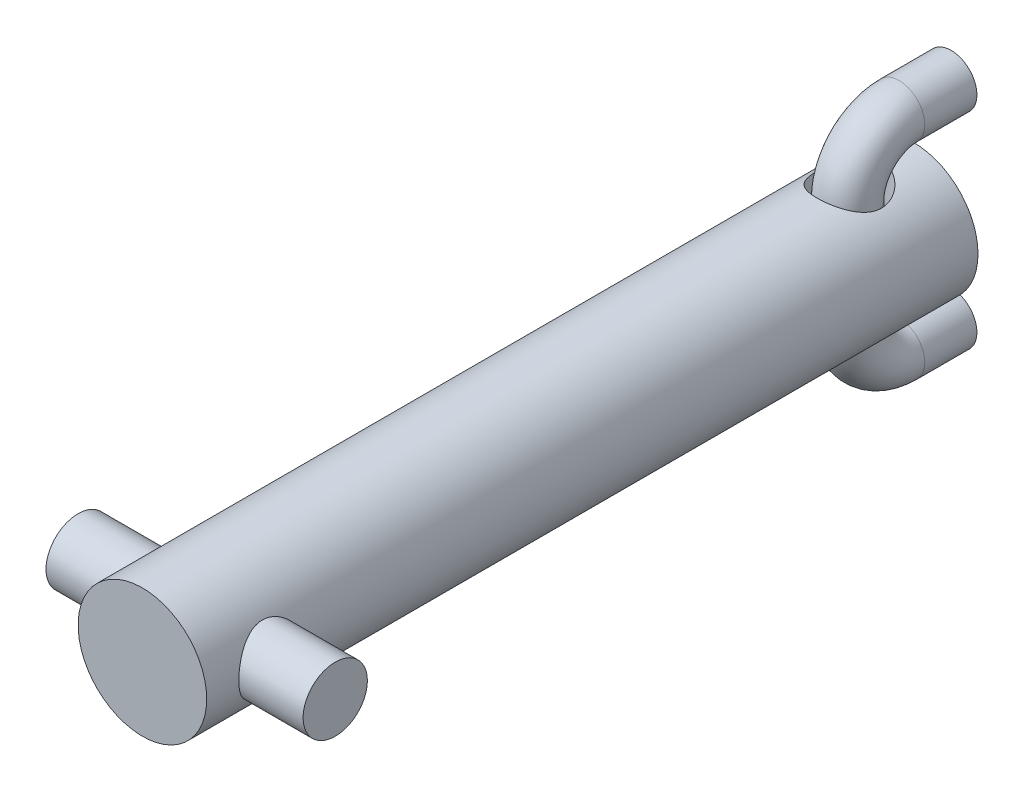
ISO-10303-21;
HEADER;
FILE_DESCRIPTION(('STEP AP214'),'2;1');
FILE_NAME('part.step','',(''),(''),'','','');
FILE_SCHEMA(('AUTOMOTIVE_DESIGN { 1 0 10303 214 1 1 1 1 }'));
ENDSEC;
DATA;
#1=APPLICATION_CONTEXT('core data for automotive mechanical design processes');
#2=APPLICATION_PROTOCOL_DEFINITION('international standard','automotive_design',2000,#1);
#3=PRODUCT_CONTEXT('',#1,'mechanical');
#4=PRODUCT('Part','Part','',(#3));
#5=PRODUCT_RELATED_PRODUCT_CATEGORY('part','',(#4));
#6=PRODUCT_DEFINITION_FORMATION('','',#4);
#7=PRODUCT_DEFINITION_CONTEXT('part definition',#1,'design');
#8=PRODUCT_DEFINITION('design','',#6,#7);
#9=PRODUCT_DEFINITION_SHAPE('','',#8);
#10=(LENGTH_UNIT() NAMED_UNIT(*) SI_UNIT(.MILLI.,.METRE.));
#11=(NAMED_UNIT(*) PLANE_ANGLE_UNIT() SI_UNIT($,.RADIAN.));
#12=(NAMED_UNIT(*) SI_UNIT($,.STERADIAN.) SOLID_ANGLE_UNIT());
#13=UNCERTAINTY_MEASURE_WITH_UNIT(LENGTH_MEASURE(1.E-05),#10,'distance_accuracy_value','');
#14=(GEOMETRIC_REPRESENTATION_CONTEXT(3) GLOBAL_UNCERTAINTY_ASSIGNED_CONTEXT((#13)) GLOBAL_UNIT_ASSIGNED_CONTEXT((#10,
#11,#12)) REPRESENTATION_CONTEXT('',''));
#15=CARTESIAN_POINT('',(0.,0.,0.));
#16=DIRECTION('',(0.,0.,1.));
#17=DIRECTION('',(1.,0.,0.));
#18=AXIS2_PLACEMENT_3D('',#15,#16,#17);
#19=CARTESIAN_POINT('',(0.,4.92250109258514,-1.85035109025268));
#20=DIRECTION('',(0.,0.,-1.));
#21=DIRECTION('',(1.,0.,0.));
#22=AXIS2_PLACEMENT_3D('',#19,#20,#21);
#23=PLANE('',#22);
#24=CARTESIAN_POINT('',(0.,4.92250109258514,-1.85035109025268));
#25=DIRECTION('',(0.,0.,-1.));
#26=DIRECTION('',(1.,0.,0.));
#27=AXIS2_PLACEMENT_3D('',#24,#25,#26);
#28=CIRCLE('',#27,1.27);
#29=CARTESIAN_POINT('',(1.27,4.92250109258514,-1.85035109025268));
#30=VERTEX_POINT('',#29);
#31=EDGE_CURVE('E66',#30,#30,#28,.T.);
#32=ORIENTED_EDGE('',*,*,#31,.T.);
#33=EDGE_LOOP('',(#32));
#34=FACE_BOUND('',#33,.T.);
#35=ADVANCED_FACE('F54',(#34),#23,.T.);
#36=CARTESIAN_POINT('',(0.,-5.23749890741486,-1.85035109025268));
#37=DIRECTION('',(0.,0.,1.));
#38=DIRECTION('',(1.,0.,0.));
#39=AXIS2_PLACEMENT_3D('',#36,#37,#38);
#40=PLANE('',#39);
#41=CARTESIAN_POINT('',(0.,-5.23749890741486,-1.85035109025268));
#42=DIRECTION('',(0.,0.,1.));
#43=DIRECTION('',(1.,0.,0.));
#44=AXIS2_PLACEMENT_3D('',#41,#42,#43);
#45=CIRCLE('',#44,1.27);
#46=CARTESIAN_POINT('',(1.27,-5.23749890741486,-1.85035109025268));
#47=VERTEX_POINT('',#46);
#48=EDGE_CURVE('E13',#47,#47,#45,.T.);
#49=ORIENTED_EDGE('',*,*,#48,.F.);
#50=EDGE_LOOP('',(#49));
#51=FACE_BOUND('',#50,.T.);
#52=ADVANCED_FACE('F72',(#51),#40,.F.);
#53=CARTESIAN_POINT('',(0.,4.92250109258514,-1.85035109025268));
#54=DIRECTION('',(0.,0.,1.));
#55=DIRECTION('',(1.,0.,0.));
#56=AXIS2_PLACEMENT_3D('',#53,#54,#55);
#57=CYLINDRICAL_SURFACE('',#56,1.27);
#58=CARTESIAN_POINT('',(0.,4.92250109258514,0.723036468645226));
#59=DIRECTION('',(0.,0.,-1.));
#60=DIRECTION('',(1.,0.,0.));
#61=AXIS2_PLACEMENT_3D('',#58,#59,#60);
#62=CIRCLE('',#61,1.27);
#63=CARTESIAN_POINT('',(0.,6.19250109258514,0.723036468645217));
#64=VERTEX_POINT('',#63);
#65=EDGE_CURVE('E106',#64,#64,#62,.T.);
#66=ORIENTED_EDGE('',*,*,#65,.T.);
#67=EDGE_LOOP('',(#66));
#68=FACE_BOUND('',#67,.T.);
#69=ORIENTED_EDGE('',*,*,#31,.F.);
#70=EDGE_LOOP('',(#69));
#71=FACE_BOUND('',#70,.T.);
#72=ADVANCED_FACE('F74',(#68,#71),#57,.T.);
#73=CARTESIAN_POINT('',(0.,2.38250109258514,0.723036468645244));
#74=DIRECTION('',(1.,0.,0.));
#75=DIRECTION('',(0.,0.,-1.));
#76=AXIS2_PLACEMENT_3D('',#73,#74,#75);
#77=TOROIDAL_SURFACE('',#76,2.54,1.27);
#78=CARTESIAN_POINT('',(0.,2.38250109258512,3.26303646864524));
#79=DIRECTION('',(0.,1.,0.));
#80=DIRECTION('',(1.,0.,0.));
#81=AXIS2_PLACEMENT_3D('',#78,#79,#80);
#82=CIRCLE('',#81,1.27);
#83=CARTESIAN_POINT('',(0.,2.38250109258512,4.53303646864524));
#84=VERTEX_POINT('',#83);
#85=EDGE_CURVE('E103',#84,#84,#82,.T.);
#86=CARTESIAN_POINT('',(0.,2.38250109258514,0.723036468645244));
#87=DIRECTION('',(1.,0.,0.));
#88=DIRECTION('',(0.,0.,-1.));
#89=AXIS2_PLACEMENT_3D('',#86,#87,#88);
#90=CIRCLE('',#89,3.81);
#91=EDGE_CURVE('',#64,#84,#90,.T.);
#92=ORIENTED_EDGE('',*,*,#65,.F.);
#93=ORIENTED_EDGE('',*,*,#85,.T.);
#94=ORIENTED_EDGE('',*,*,#91,.T.);
#95=ORIENTED_EDGE('',*,*,#91,.F.);
#96=EDGE_LOOP('',(#92,#94,#93,#95));
#97=FACE_BOUND('',#96,.T.);
#98=ADVANCED_FACE('F79',(#97),#77,.T.);
#99=CARTESIAN_POINT('',(0.,2.38250109258512,3.26303646864524));
#100=DIRECTION('',(0.,-1.,0.));
#101=DIRECTION('',(0.,0.,-1.));
#102=AXIS2_PLACEMENT_3D('',#99,#100,#101);
#103=CYLINDRICAL_SURFACE('',#102,1.27);
#104=CARTESIAN_POINT('',(0.,-2.69749890741484,3.26303646864524));
#105=DIRECTION('',(0.,1.,0.));
#106=DIRECTION('',(1.,0.,0.));
#107=AXIS2_PLACEMENT_3D('',#104,#105,#106);
#108=CIRCLE('',#107,1.27);
#109=CARTESIAN_POINT('',(0.,-2.69749890741483,4.53303646864524));
#110=VERTEX_POINT('',#109);
#111=EDGE_CURVE('E108',#110,#110,#108,.T.);
#112=ORIENTED_EDGE('',*,*,#111,.T.);
#113=EDGE_LOOP('',(#112));
#114=FACE_BOUND('',#113,.T.);
#115=ORIENTED_EDGE('',*,*,#85,.F.);
#116=EDGE_LOOP('',(#115));
#117=FACE_BOUND('',#116,.T.);
#118=ADVANCED_FACE('F89',(#114,#117),#103,.T.);
#119=CARTESIAN_POINT('',(0.,-2.69749890741486,0.723036468645245));
#120=DIRECTION('',(1.,0.,0.));
#121=DIRECTION('',(0.,0.,-1.));
#122=AXIS2_PLACEMENT_3D('',#119,#120,#121);
#123=TOROIDAL_SURFACE('',#122,2.54,1.27);
#124=CARTESIAN_POINT('',(0.,-5.23749890741487,0.723036468645263));
#125=DIRECTION('',(0.,0.,1.));
#126=DIRECTION('',(1.,0.,0.));
#127=AXIS2_PLACEMENT_3D('',#124,#125,#126);
#128=CIRCLE('',#127,1.27);
#129=CARTESIAN_POINT('',(0.,-6.50749890741486,0.723036468645273));
#130=VERTEX_POINT('',#129);
#131=EDGE_CURVE('E61',#130,#130,#128,.T.);
#132=CARTESIAN_POINT('',(0.,-2.69749890741486,0.723036468645245));
#133=DIRECTION('',(1.,0.,0.));
#134=DIRECTION('',(0.,0.,-1.));
#135=AXIS2_PLACEMENT_3D('',#132,#133,#134);
#136=CIRCLE('',#135,3.81);
#137=EDGE_CURVE('',#110,#130,#136,.T.);
#138=ORIENTED_EDGE('',*,*,#111,.F.);
#139=ORIENTED_EDGE('',*,*,#131,.T.);
#140=ORIENTED_EDGE('',*,*,#137,.T.);
#141=ORIENTED_EDGE('',*,*,#137,.F.);
#142=EDGE_LOOP('',(#138,#140,#139,#141));
#143=FACE_BOUND('',#142,.T.);
#144=ADVANCED_FACE('F85',(#143),#123,.T.);
#145=CARTESIAN_POINT('',(0.,-5.23749890741486,0.723036468645228));
#146=DIRECTION('',(0.,0.,-1.));
#147=DIRECTION('',(-1.,0.,0.));
#148=AXIS2_PLACEMENT_3D('',#145,#146,#147);
#149=CYLINDRICAL_SURFACE('',#148,1.27);
#150=ORIENTED_EDGE('',*,*,#48,.T.);
#151=EDGE_LOOP('',(#150));
#152=FACE_BOUND('',#151,.T.);
#153=ORIENTED_EDGE('',*,*,#131,.F.);
#154=EDGE_LOOP('',(#153));
#155=FACE_BOUND('',#154,.T.);
#156=ADVANCED_FACE('F69',(#152,#155),#149,.T.);
#157=CLOSED_SHELL('',(#35,#52,#72,#98,#118,#144,#156));
#158=MANIFOLD_SOLID_BREP('B2',#157);
#159=CARTESIAN_POINT('',(0.,0.,38.1));
#160=DIRECTION('',(0.,0.,-1.));
#161=DIRECTION('',(-1.,0.,0.));
#162=AXIS2_PLACEMENT_3D('',#159,#160,#161);
#163=CYLINDRICAL_SURFACE('',#162,3.175);
#164=CARTESIAN_POINT('',(0.,-3.175,4.7625));
#165=CARTESIAN_POINT('',(0.083457991185083,-3.17499545030502,4.76249475757146));
#166=CARTESIAN_POINT('',(0.16701547701988,-3.17167404493863,4.75588000892032));
#167=CARTESIAN_POINT('',(0.331660873489372,-3.15871472708987,4.72971355245781));
#168=CARTESIAN_POINT('',(0.412743787657886,-3.1490648192841,4.71013727611597));
#169=CARTESIAN_POINT('',(0.569807002497712,-3.12445843552858,4.6590048288211));
#170=CARTESIAN_POINT('',(0.645805799665894,-3.10952259694341,4.62749521500635));
#171=CARTESIAN_POINT('',(0.791325279180474,-3.07571420218771,4.55363163858309));
#172=CARTESIAN_POINT('',(0.860846471709218,-3.05684195643221,4.51127853100493));
#173=CARTESIAN_POINT('',(0.99616866069703,-3.01555559984673,4.41401636644211));
#174=CARTESIAN_POINT('',(1.06149014765635,-2.99299628614965,4.35850271420707));
#175=CARTESIAN_POINT('',(1.18233736872633,-2.94735202766705,4.23779715169533));
#176=CARTESIAN_POINT('',(1.23785563818199,-2.92426669731842,4.17259793531125));
#177=CARTESIAN_POINT('',(1.34183755071481,-2.87812085025789,4.02830768263163));
#178=CARTESIAN_POINT('',(1.38942022018822,-2.85520109315084,3.94853144387586));
#179=CARTESIAN_POINT('',(1.47029206018898,-2.81441491301059,3.78084185412188));
#180=CARTESIAN_POINT('',(1.50359144125905,-2.79654488326096,3.69293437065264));
#181=CARTESIAN_POINT('',(1.55278525197438,-2.76951863922521,3.5168441451427));
#182=CARTESIAN_POINT('',(1.5696022981152,-2.75990481139145,3.42899293234301));
#183=CARTESIAN_POINT('',(1.58817785187779,-2.74926250293288,3.25123359502508));
#184=CARTESIAN_POINT('',(1.58995124029226,-2.7482255383247,3.16132759136704));
#185=CARTESIAN_POINT('',(1.57906606838602,-2.75448601783382,2.99357093639935));
#186=CARTESIAN_POINT('',(1.5681079882647,-2.76080162313447,2.91556435043341));
#187=CARTESIAN_POINT('',(1.53501701037788,-2.77933513114987,2.76269146887029));
#188=CARTESIAN_POINT('',(1.51288055293752,-2.79155491395445,2.68782618182781));
#189=CARTESIAN_POINT('',(1.45765802636278,-2.82078868805226,2.54122375205201));
#190=CARTESIAN_POINT('',(1.42432891904664,-2.83790772054098,2.46960009192756));
#191=CARTESIAN_POINT('',(1.34785367917295,-2.87501654296728,2.33261806051336));
#192=CARTESIAN_POINT('',(1.30470313705229,-2.89500762088553,2.26726252223486));
#193=CARTESIAN_POINT('',(1.20342986217405,-2.93867138171466,2.13594751127013));
#194=CARTESIAN_POINT('',(1.14410245266123,-2.96248947500834,2.07096221319785));
#195=CARTESIAN_POINT('',(1.01529448125193,-3.00906851989396,1.95145752298694));
#196=CARTESIAN_POINT('',(0.945809094811679,-3.03182896234596,1.89694313264621));
#197=CARTESIAN_POINT('',(0.79456995300806,-3.07501904811705,1.79754901311531));
#198=CARTESIAN_POINT('',(0.712396326664062,-3.09529137357186,1.75323424999239));
#199=CARTESIAN_POINT('',(0.540490117088466,-3.12988136279972,1.67942096639422));
#200=CARTESIAN_POINT('',(0.450763602321127,-3.14420375322891,1.64991068128842));
#201=CARTESIAN_POINT('',(0.274266805511366,-3.16427379814529,1.60897029659978));
#202=CARTESIAN_POINT('',(0.187867179745469,-3.17063339553329,1.59624516325198));
#203=CARTESIAN_POINT('',(0.013937614919597,-3.17615908866327,1.585174739324));
#204=CARTESIAN_POINT('',(-0.0735917690434789,-3.17532859220093,1.58682263654734));
#205=CARTESIAN_POINT('',(-0.240082343027753,-3.16692267702328,1.60370311786476));
#206=CARTESIAN_POINT('',(-0.319181810279264,-3.15987502529967,1.61787289570887));
#207=CARTESIAN_POINT('',(-0.473720941529331,-3.14042696962309,1.65772793913351));
#208=CARTESIAN_POINT('',(-0.5491602010346,-3.12802597555879,1.68341447424492));
#209=CARTESIAN_POINT('',(-0.696735665913696,-3.09854999119071,1.74624756546244));
#210=CARTESIAN_POINT('',(-0.768715755246713,-3.08135149809289,1.78370079205961));
#211=CARTESIAN_POINT('',(-0.905607411697593,-3.043935592289,1.86865821283893));
#212=CARTESIAN_POINT('',(-0.970515949770339,-3.02371689462514,1.91616668867019));
#213=CARTESIAN_POINT('',(-1.09818120674663,-2.97986801371214,2.02526967521251));
#214=CARTESIAN_POINT('',(-1.16010067353771,-2.95609779689055,2.08778930365667));
#215=CARTESIAN_POINT('',(-1.27294690977618,-2.90929046679002,2.22238117765339));
#216=CARTESIAN_POINT('',(-1.3238660748176,-2.88625386997575,2.29445997617107));
#217=CARTESIAN_POINT('',(-1.41558631423544,-2.84243767627802,2.4505343009996));
#218=CARTESIAN_POINT('',(-1.45577797458289,-2.82182140722634,2.53493788492499));
#219=CARTESIAN_POINT('',(-1.52095648617134,-2.78723839766939,2.71067223227526));
#220=CARTESIAN_POINT('',(-1.54596292893889,-2.77326309427028,2.80199389826619));
#221=CARTESIAN_POINT('',(-1.57775542885366,-2.75528882878461,2.97959497882947));
#222=CARTESIAN_POINT('',(-1.58606013179365,-2.75046096250791,3.06551687732845));
#223=CARTESIAN_POINT('',(-1.58859403257222,-2.74900000493545,3.23762221912368));
#224=CARTESIAN_POINT('',(-1.5828293315144,-2.75236336156894,3.32380553287135));
#225=CARTESIAN_POINT('',(-1.55880772437938,-2.76602606006084,3.48533005868433));
#226=CARTESIAN_POINT('',(-1.54179319901957,-2.7756341249122,3.56092199635477));
#227=CARTESIAN_POINT('',(-1.49729088118125,-2.79988988197899,3.70809538958618));
#228=CARTESIAN_POINT('',(-1.46979971971638,-2.81453919516849,3.7796755465711));
#229=CARTESIAN_POINT('',(-1.40305749566465,-2.848427919537,3.92211695094113));
#230=CARTESIAN_POINT('',(-1.36314043128243,-2.86790959303524,3.99260679415358));
#231=CARTESIAN_POINT('',(-1.27341466747436,-2.90886088970341,4.12634832618775));
#232=CARTESIAN_POINT('',(-1.22360082184598,-2.93033154400532,4.18959622220226));
#233=CARTESIAN_POINT('',(-1.10839778107493,-2.97596438013471,4.31505039698805));
#234=CARTESIAN_POINT('',(-1.04185152150815,-3.00013660999272,4.37619632498109));
#235=CARTESIAN_POINT('',(-0.898770754895201,-3.0460593171264,4.48669248620349));
#236=CARTESIAN_POINT('',(-0.822230898247,-3.06780848569085,4.53603636140848));
#237=CARTESIAN_POINT('',(-0.660291409892926,-3.10670590186878,4.62158772580541));
#238=CARTESIAN_POINT('',(-0.574832962245559,-3.12382053184118,4.65769986866289));
#239=CARTESIAN_POINT('',(-0.398053085556712,-3.15120879312142,4.71457046631489));
#240=CARTESIAN_POINT('',(-0.306749131847695,-3.1615018583887,4.73537255680407));
#241=CARTESIAN_POINT('',(-0.178755590054295,-3.17016545787646,4.75281214009861));
#242=CARTESIAN_POINT('',(-0.143131983613483,-3.17197367477648,4.75643994237531));
#243=CARTESIAN_POINT('',(-0.0716783742405821,-3.17439193950695,4.76128503150361));
#244=CARTESIAN_POINT('',(-0.0358483656390222,-3.17500195426617,4.76250225182145));
#245=CARTESIAN_POINT('',(0.,-3.175,4.7625));
#246=B_SPLINE_CURVE_WITH_KNOTS('',3,(#164,#165,#166,#167,#168,#169,#170,#171,#172,#173,#174,
#175,#176,#177,#178,#179,#180,#181,#182,#183,#184,#185,#186,#187,#188,#189,#190,#191,#192,#193,
#194,#195,#196,#197,#198,#199,#200,#201,#202,#203,#204,#205,#206,#207,#208,#209,#210,#211,#212,
#213,#214,#215,#216,#217,#218,#219,#220,#221,#222,#223,#224,#225,#226,#227,#228,#229,#230,#231,
#232,#233,#234,#235,#236,#237,#238,#239,#240,#241,#242,#243,#244,#245),.UNSPECIFIED.,.T.,.F.,(4,
2,2,2,2,2,2,2,2,2,2,2,2,2,2,2,2,2,2,2,2,2,2,2,2,2,2,2,2,2,2,2,2,2,2,2,2,2,2,2,4),(0.,
0.250228508654714,0.50093268766335,0.750668671844022,1.00038496992324,1.26520854196496,
1.53023290227578,1.8158099070882,2.10118242288521,2.36947094272614,2.6374940475982,
2.87346568449797,3.10951251232015,3.35105756267474,3.59271127500602,3.86500594367532,
4.13743036175414,4.42250547765424,4.70735369348244,4.96860973623261,5.22974196161968,
5.47063464078469,5.71155388089104,5.95936158944289,6.20727503062989,6.47953381898015,
6.75198021926998,7.0376205793174,7.32289162713403,7.58077775661086,7.83855207535177,
8.07176964270058,8.30506226951507,8.55402875138706,8.80312503315514,9.0824882287701,
9.36200158617728,9.64349121690848,9.92417542436075,10.0316550721259,10.1391376863632),.UNSPECIFIED.);
#247=CARTESIAN_POINT('',(0.,-3.175,4.7625));
#248=VERTEX_POINT('',#247);
#249=EDGE_CURVE('E181',#248,#248,#246,.T.);
#250=ORIENTED_EDGE('',*,*,#249,.T.);
#251=EDGE_LOOP('',(#250));
#252=FACE_BOUND('',#251,.T.);
#253=CARTESIAN_POINT('',(0.,3.175,4.7625));
#254=CARTESIAN_POINT('',(-0.0834579911850828,3.17499545030503,4.76249475757146));
#255=CARTESIAN_POINT('',(-0.16701547701988,3.17167404493863,4.75588000892032));
#256=CARTESIAN_POINT('',(-0.331660873489372,3.15871472708987,4.72971355245781));
#257=CARTESIAN_POINT('',(-0.412743787657886,3.1490648192841,4.71013727611597));
#258=CARTESIAN_POINT('',(-0.569807002497712,3.12445843552858,4.6590048288211));
#259=CARTESIAN_POINT('',(-0.645805799665894,3.10952259694341,4.62749521500635));
#260=CARTESIAN_POINT('',(-0.791325279180474,3.07571420218771,4.55363163858309));
#261=CARTESIAN_POINT('',(-0.860846471709217,3.05684195643221,4.51127853100493));
#262=CARTESIAN_POINT('',(-0.99616866069703,3.01555559984673,4.41401636644211));
#263=CARTESIAN_POINT('',(-1.06149014765635,2.99299628614965,4.35850271420707));
#264=CARTESIAN_POINT('',(-1.18233736872633,2.94735202766705,4.23779715169533));
#265=CARTESIAN_POINT('',(-1.23785563818199,2.92426669731843,4.17259793531125));
#266=CARTESIAN_POINT('',(-1.34183755071481,2.87812085025789,4.02830768263163));
#267=CARTESIAN_POINT('',(-1.38942022018822,2.85520109315084,3.94853144387586));
#268=CARTESIAN_POINT('',(-1.47029206018898,2.81441491301059,3.78084185412188));
#269=CARTESIAN_POINT('',(-1.50359144125905,2.79654488326096,3.69293437065264));
#270=CARTESIAN_POINT('',(-1.55278525197438,2.76951863922521,3.5168441451427));
#271=CARTESIAN_POINT('',(-1.5696022981152,2.75990481139145,3.42899293234301));
#272=CARTESIAN_POINT('',(-1.58817785187779,2.74926250293288,3.25123359502508));
#273=CARTESIAN_POINT('',(-1.58995124029226,2.7482255383247,3.16132759136704));
#274=CARTESIAN_POINT('',(-1.57906606838602,2.75448601783382,2.99357093639935));
#275=CARTESIAN_POINT('',(-1.5681079882647,2.76080162313447,2.91556435043341));
#276=CARTESIAN_POINT('',(-1.53501701037788,2.77933513114987,2.76269146887029));
#277=CARTESIAN_POINT('',(-1.51288055293752,2.79155491395445,2.68782618182781));
#278=CARTESIAN_POINT('',(-1.45765802636278,2.82078868805226,2.54122375205201));
#279=CARTESIAN_POINT('',(-1.42432891904664,2.83790772054098,2.46960009192756));
#280=CARTESIAN_POINT('',(-1.34785367917295,2.87501654296728,2.33261806051336));
#281=CARTESIAN_POINT('',(-1.30470313705229,2.89500762088553,2.26726252223486));
#282=CARTESIAN_POINT('',(-1.20342986217405,2.93867138171466,2.13594751127013));
#283=CARTESIAN_POINT('',(-1.14410245266124,2.96248947500834,2.07096221319785));
#284=CARTESIAN_POINT('',(-1.01529448125193,3.00906851989396,1.95145752298694));
#285=CARTESIAN_POINT('',(-0.945809094811679,3.03182896234596,1.89694313264621));
#286=CARTESIAN_POINT('',(-0.794569953008061,3.07501904811705,1.79754901311531));
#287=CARTESIAN_POINT('',(-0.712396326664063,3.09529137357186,1.75323424999239));
#288=CARTESIAN_POINT('',(-0.540490117088467,3.12988136279972,1.67942096639422));
#289=CARTESIAN_POINT('',(-0.450763602321127,3.14420375322891,1.64991068128842));
#290=CARTESIAN_POINT('',(-0.274266805511367,3.16427379814529,1.60897029659978));
#291=CARTESIAN_POINT('',(-0.18786717974547,3.17063339553329,1.59624516325198));
#292=CARTESIAN_POINT('',(-0.0139376149195974,3.17615908866327,1.585174739324));
#293=CARTESIAN_POINT('',(0.0735917690434786,3.17532859220093,1.58682263654734));
#294=CARTESIAN_POINT('',(0.240082343027753,3.16692267702328,1.60370311786476));
#295=CARTESIAN_POINT('',(0.319181810279263,3.15987502529967,1.61787289570887));
#296=CARTESIAN_POINT('',(0.47372094152933,3.14042696962309,1.65772793913351));
#297=CARTESIAN_POINT('',(0.5491602010346,3.12802597555879,1.68341447424492));
#298=CARTESIAN_POINT('',(0.696735665913696,3.09854999119071,1.74624756546244));
#299=CARTESIAN_POINT('',(0.768715755246713,3.08135149809289,1.78370079205961));
#300=CARTESIAN_POINT('',(0.905607411697593,3.043935592289,1.86865821283893));
#301=CARTESIAN_POINT('',(0.970515949770339,3.02371689462514,1.91616668867019));
#302=CARTESIAN_POINT('',(1.09818120674663,2.97986801371214,2.02526967521251));
#303=CARTESIAN_POINT('',(1.1601006735377,2.95609779689055,2.08778930365667));
#304=CARTESIAN_POINT('',(1.27294690977618,2.90929046679002,2.22238117765339));
#305=CARTESIAN_POINT('',(1.3238660748176,2.88625386997575,2.29445997617107));
#306=CARTESIAN_POINT('',(1.41558631423544,2.84243767627802,2.4505343009996));
#307=CARTESIAN_POINT('',(1.45577797458289,2.82182140722634,2.53493788492499));
#308=CARTESIAN_POINT('',(1.52095648617134,2.78723839766939,2.71067223227526));
#309=CARTESIAN_POINT('',(1.54596292893889,2.77326309427028,2.80199389826619));
#310=CARTESIAN_POINT('',(1.57775542885366,2.75528882878461,2.97959497882947));
#311=CARTESIAN_POINT('',(1.58606013179365,2.75046096250791,3.06551687732845));
#312=CARTESIAN_POINT('',(1.58859403257222,2.74900000493545,3.23762221912368));
#313=CARTESIAN_POINT('',(1.5828293315144,2.75236336156894,3.32380553287135));
#314=CARTESIAN_POINT('',(1.55880772437938,2.76602606006084,3.48533005868433));
#315=CARTESIAN_POINT('',(1.54179319901957,2.7756341249122,3.56092199635477));
#316=CARTESIAN_POINT('',(1.49729088118125,2.79988988197899,3.70809538958618));
#317=CARTESIAN_POINT('',(1.46979971971638,2.81453919516849,3.7796755465711));
#318=CARTESIAN_POINT('',(1.40305749566465,2.848427919537,3.92211695094113));
#319=CARTESIAN_POINT('',(1.36314043128243,2.86790959303524,3.99260679415358));
#320=CARTESIAN_POINT('',(1.27341466747436,2.90886088970341,4.12634832618775));
#321=CARTESIAN_POINT('',(1.22360082184598,2.93033154400532,4.18959622220226));
#322=CARTESIAN_POINT('',(1.10839778107493,2.97596438013471,4.31505039698805));
#323=CARTESIAN_POINT('',(1.04185152150815,3.00013660999272,4.37619632498109));
#324=CARTESIAN_POINT('',(0.8987707548952,3.0460593171264,4.48669248620349));
#325=CARTESIAN_POINT('',(0.822230898247,3.06780848569085,4.53603636140848));
#326=CARTESIAN_POINT('',(0.660291409892925,3.10670590186878,4.62158772580541));
#327=CARTESIAN_POINT('',(0.574832962245559,3.12382053184118,4.65769986866289));
#328=CARTESIAN_POINT('',(0.398053085556711,3.15120879312142,4.71457046631489));
#329=CARTESIAN_POINT('',(0.306749131847695,3.1615018583887,4.73537255680407));
#330=CARTESIAN_POINT('',(0.178755590054295,3.17016545787646,4.75281214009861));
#331=CARTESIAN_POINT('',(0.143131983613483,3.17197367477648,4.75643994237531));
#332=CARTESIAN_POINT('',(0.0716783742405818,3.17439193950695,4.76128503150361));
#333=CARTESIAN_POINT('',(0.0358483656390221,3.17500195426617,4.76250225182145));
#334=CARTESIAN_POINT('',(0.,3.175,4.7625));
#335=B_SPLINE_CURVE_WITH_KNOTS('',3,(#253,#254,#255,#256,#257,#258,#259,#260,#261,#262,#263,
#264,#265,#266,#267,#268,#269,#270,#271,#272,#273,#274,#275,#276,#277,#278,#279,#280,#281,#282,
#283,#284,#285,#286,#287,#288,#289,#290,#291,#292,#293,#294,#295,#296,#297,#298,#299,#300,#301,
#302,#303,#304,#305,#306,#307,#308,#309,#310,#311,#312,#313,#314,#315,#316,#317,#318,#319,#320,
#321,#322,#323,#324,#325,#326,#327,#328,#329,#330,#331,#332,#333,#334),.UNSPECIFIED.,.T.,.F.,(4,
2,2,2,2,2,2,2,2,2,2,2,2,2,2,2,2,2,2,2,2,2,2,2,2,2,2,2,2,2,2,2,2,2,2,2,2,2,2,2,4),(0.,
0.250228508654714,0.50093268766335,0.750668671844022,1.00038496992324,1.26520854196496,
1.53023290227578,1.8158099070882,2.10118242288521,2.36947094272614,2.6374940475982,
2.87346568449796,3.10951251232015,3.35105756267474,3.59271127500602,3.86500594367532,
4.13743036175414,4.42250547765424,4.70735369348243,4.96860973623261,5.22974196161968,
5.47063464078468,5.71155388089104,5.95936158944289,6.20727503062988,6.47953381898015,
6.75198021926998,7.03762057931739,7.32289162713403,7.58077775661086,7.83855207535176,
8.07176964270058,8.30506226951507,8.55402875138705,8.80312503315514,9.0824882287701,
9.36200158617727,9.64349121690848,9.92417542436075,10.0316550721259,10.1391376863632),.UNSPECIFIED.);
#336=CARTESIAN_POINT('',(0.,3.175,4.7625));
#337=VERTEX_POINT('',#336);
#338=EDGE_CURVE('E205',#337,#337,#335,.T.);
#339=ORIENTED_EDGE('',*,*,#338,.T.);
#340=EDGE_LOOP('',(#339));
#341=FACE_BOUND('',#340,.T.);
#342=CARTESIAN_POINT('',(0.,0.,38.1));
#343=DIRECTION('',(0.,0.,1.));
#344=DIRECTION('',(1.,0.,0.));
#345=AXIS2_PLACEMENT_3D('',#342,#343,#344);
#346=CIRCLE('',#345,3.175);
#347=CARTESIAN_POINT('',(3.175,0.,38.1));
#348=VERTEX_POINT('',#347);
#349=EDGE_CURVE('E171',#348,#348,#346,.T.);
#350=ORIENTED_EDGE('',*,*,#349,.F.);
#351=EDGE_LOOP('',(#350));
#352=FACE_BOUND('',#351,.T.);
#353=CARTESIAN_POINT('',(0.,0.,0.));
#354=DIRECTION('',(0.,0.,1.));
#355=DIRECTION('',(1.,0.,0.));
#356=AXIS2_PLACEMENT_3D('',#353,#354,#355);
#357=CIRCLE('',#356,3.175);
#358=CARTESIAN_POINT('',(3.175,0.,0.));
#359=VERTEX_POINT('',#358);
#360=EDGE_CURVE('E175',#359,#359,#357,.T.);
#361=ORIENTED_EDGE('',*,*,#360,.T.);
#362=EDGE_LOOP('',(#361));
#363=FACE_BOUND('',#362,.T.);
#364=CARTESIAN_POINT('',(3.175,0.,36.5125));
#365=CARTESIAN_POINT('',(3.17499545030503,-0.0834579911850831,36.5124947575715));
#366=CARTESIAN_POINT('',(3.17167404493863,-0.16701547701988,36.5058800089203));
#367=CARTESIAN_POINT('',(3.15871472708987,-0.331660873489373,36.4797135524578));
#368=CARTESIAN_POINT('',(3.1490648192841,-0.412743787657887,36.460137276116));
#369=CARTESIAN_POINT('',(3.12445843552858,-0.569807002497713,36.4090048288211));
#370=CARTESIAN_POINT('',(3.10952259694341,-0.645805799665895,36.3774952150064));
#371=CARTESIAN_POINT('',(3.07571420218771,-0.791325279180475,36.3036316385831));
#372=CARTESIAN_POINT('',(3.05684195643221,-0.860846471709218,36.2612785310049));
#373=CARTESIAN_POINT('',(3.01555559984673,-0.996168660697029,36.1640163664421));
#374=CARTESIAN_POINT('',(2.99299628614965,-1.06149014765635,36.1085027142071));
#375=CARTESIAN_POINT('',(2.94735202766705,-1.18233736872633,35.9877971516953));
#376=CARTESIAN_POINT('',(2.92426669731843,-1.23785563818199,35.9225979353113));
#377=CARTESIAN_POINT('',(2.87812085025789,-1.34183755071481,35.7783076826316));
#378=CARTESIAN_POINT('',(2.85520109315084,-1.38942022018822,35.6985314438759));
#379=CARTESIAN_POINT('',(2.81441491301059,-1.47029206018898,35.5308418541219));
#380=CARTESIAN_POINT('',(2.79654488326096,-1.50359144125906,35.4429343706526));
#381=CARTESIAN_POINT('',(2.76951863922521,-1.55278525197438,35.2668441451427));
#382=CARTESIAN_POINT('',(2.75990481139145,-1.5696022981152,35.178992932343));
#383=CARTESIAN_POINT('',(2.74926250293288,-1.58817785187779,35.0012335950251));
#384=CARTESIAN_POINT('',(2.7482255383247,-1.58995124029225,34.9113275913671));
#385=CARTESIAN_POINT('',(2.75448601783382,-1.57906606838602,34.7435709363994));
#386=CARTESIAN_POINT('',(2.76080162313446,-1.5681079882647,34.6655643504334));
#387=CARTESIAN_POINT('',(2.77933513114987,-1.53501701037788,34.5126914688703));
#388=CARTESIAN_POINT('',(2.79155491395445,-1.51288055293752,34.4378261818278));
#389=CARTESIAN_POINT('',(2.82078868805226,-1.45765802636278,34.291223752052));
#390=CARTESIAN_POINT('',(2.83790772054098,-1.42432891904664,34.2196000919276));
#391=CARTESIAN_POINT('',(2.87501654296728,-1.34785367917296,34.0826180605134));
#392=CARTESIAN_POINT('',(2.89500762088552,-1.30470313705229,34.0172625222349));
#393=CARTESIAN_POINT('',(2.93867138171466,-1.20342986217405,33.8859475112701));
#394=CARTESIAN_POINT('',(2.96248947500834,-1.14410245266123,33.8209622131979));
#395=CARTESIAN_POINT('',(3.00906851989397,-1.01529448125193,33.701457522987));
#396=CARTESIAN_POINT('',(3.03182896234596,-0.945809094811676,33.6469431326462));
#397=CARTESIAN_POINT('',(3.07501904811705,-0.794569953008058,33.5475490131153));
#398=CARTESIAN_POINT('',(3.09529137357186,-0.71239632666406,33.5032342499924));
#399=CARTESIAN_POINT('',(3.12988136279972,-0.540490117088465,33.4294209663942));
#400=CARTESIAN_POINT('',(3.14420375322891,-0.450763602321128,33.3999106812884));
#401=CARTESIAN_POINT('',(3.16427379814529,-0.274266805511368,33.3589702965998));
#402=CARTESIAN_POINT('',(3.17063339553329,-0.18786717974547,33.346245163252));
#403=CARTESIAN_POINT('',(3.17615908866327,-0.0139376149195973,33.335174739324));
#404=CARTESIAN_POINT('',(3.17532859220093,0.0735917690434788,33.3368226365474));
#405=CARTESIAN_POINT('',(3.16692267702328,0.240082343027752,33.3537031178648));
#406=CARTESIAN_POINT('',(3.15987502529967,0.319181810279261,33.3678728957089));
#407=CARTESIAN_POINT('',(3.14042696962309,0.473720941529329,33.4077279391335));
#408=CARTESIAN_POINT('',(3.12802597555879,0.549160201034598,33.4334144742449));
#409=CARTESIAN_POINT('',(3.09854999119071,0.696735665913695,33.4962475654625));
#410=CARTESIAN_POINT('',(3.08135149809289,0.768715755246712,33.5337007920596));
#411=CARTESIAN_POINT('',(3.04393559228901,0.905607411697592,33.6186582128389));
#412=CARTESIAN_POINT('',(3.02371689462515,0.970515949770337,33.6661666886702));
#413=CARTESIAN_POINT('',(2.97986801371214,1.09818120674663,33.7752696752125));
#414=CARTESIAN_POINT('',(2.95609779689055,1.1601006735377,33.8377893036567));
#415=CARTESIAN_POINT('',(2.90929046679002,1.27294690977618,33.9723811776534));
#416=CARTESIAN_POINT('',(2.88625386997575,1.3238660748176,34.0444599761711));
#417=CARTESIAN_POINT('',(2.84243767627802,1.41558631423544,34.2005343009996));
#418=CARTESIAN_POINT('',(2.82182140722634,1.45577797458289,34.284937884925));
#419=CARTESIAN_POINT('',(2.78723839766939,1.52095648617134,34.4606722322753));
#420=CARTESIAN_POINT('',(2.77326309427028,1.54596292893889,34.5519938982662));
#421=CARTESIAN_POINT('',(2.75528882878461,1.57775542885366,34.7295949788295));
#422=CARTESIAN_POINT('',(2.75046096250791,1.58606013179365,34.8155168773284));
#423=CARTESIAN_POINT('',(2.74900000493545,1.58859403257222,34.9876222191237));
#424=CARTESIAN_POINT('',(2.75236336156894,1.5828293315144,35.0738055328714));
#425=CARTESIAN_POINT('',(2.76602606006084,1.55880772437938,35.2353300586843));
#426=CARTESIAN_POINT('',(2.7756341249122,1.54179319901956,35.3109219963548));
#427=CARTESIAN_POINT('',(2.79988988197899,1.49729088118125,35.4580953895862));
#428=CARTESIAN_POINT('',(2.81453919516849,1.46979971971637,35.5296755465711));
#429=CARTESIAN_POINT('',(2.848427919537,1.40305749566465,35.6721169509411));
#430=CARTESIAN_POINT('',(2.86790959303524,1.36314043128242,35.7426067941536));
#431=CARTESIAN_POINT('',(2.90886088970341,1.27341466747436,35.8763483261878));
#432=CARTESIAN_POINT('',(2.93033154400532,1.22360082184598,35.9395962222023));
#433=CARTESIAN_POINT('',(2.97596438013471,1.10839778107493,36.0650503969881));
#434=CARTESIAN_POINT('',(3.00013660999272,1.04185152150815,36.1261963249811));
#435=CARTESIAN_POINT('',(3.0460593171264,0.898770754895202,36.2366924862035));
#436=CARTESIAN_POINT('',(3.06780848569085,0.822230898247002,36.2860363614085));
#437=CARTESIAN_POINT('',(3.10670590186878,0.660291409892929,36.3715877258054));
#438=CARTESIAN_POINT('',(3.12382053184118,0.574832962245563,36.4076998686629));
#439=CARTESIAN_POINT('',(3.15120879312141,0.398053085556715,36.4645704663149));
#440=CARTESIAN_POINT('',(3.1615018583887,0.306749131847698,36.4853725568041));
#441=CARTESIAN_POINT('',(3.17016545787646,0.178755590054296,36.5028121400986));
#442=CARTESIAN_POINT('',(3.17197367477648,0.143131983613484,36.5064399423753));
#443=CARTESIAN_POINT('',(3.17439193950695,0.071678374240583,36.5112850315036));
#444=CARTESIAN_POINT('',(3.17500195426617,0.0358483656390227,36.5125022518215));
#445=CARTESIAN_POINT('',(3.175,0.,36.5125));
#446=B_SPLINE_CURVE_WITH_KNOTS('',3,(#364,#365,#366,#367,#368,#369,#370,#371,#372,#373,#374,
#375,#376,#377,#378,#379,#380,#381,#382,#383,#384,#385,#386,#387,#388,#389,#390,#391,#392,#393,
#394,#395,#396,#397,#398,#399,#400,#401,#402,#403,#404,#405,#406,#407,#408,#409,#410,#411,#412,
#413,#414,#415,#416,#417,#418,#419,#420,#421,#422,#423,#424,#425,#426,#427,#428,#429,#430,#431,
#432,#433,#434,#435,#436,#437,#438,#439,#440,#441,#442,#443,#444,#445),.UNSPECIFIED.,.T.,.F.,(4,
2,2,2,2,2,2,2,2,2,2,2,2,2,2,2,2,2,2,2,2,2,2,2,2,2,2,2,2,2,2,2,2,2,2,2,2,2,2,2,4),(0.,
0.250228508654715,0.50093268766335,0.750668671844024,1.00038496992324,1.26520854196496,
1.53023290227578,1.8158099070882,2.10118242288522,2.36947094272614,2.63749404759819,
2.87346568449795,3.10951251232014,3.35105756267472,3.59271127500601,3.86500594367532,
4.13743036175415,4.42250547765424,4.70735369348243,4.96860973623261,5.22974196161968,
5.47063464078468,5.71155388089103,5.95936158944289,6.20727503062988,6.47953381898014,
6.75198021926998,7.03762057931739,7.32289162713402,7.58077775661085,7.83855207535176,
8.07176964270058,8.30506226951506,8.55402875138705,8.80312503315513,9.08248822877009,
9.36200158617726,9.64349121690847,9.92417542436073,10.0316550721259,10.1391376863632),.UNSPECIFIED.);
#447=CARTESIAN_POINT('',(3.175,0.,36.5125));
#448=VERTEX_POINT('',#447);
#449=EDGE_CURVE('E167',#448,#448,#446,.T.);
#450=ORIENTED_EDGE('',*,*,#449,.F.);
#451=EDGE_LOOP('',(#450));
#452=FACE_BOUND('',#451,.T.);
#453=CARTESIAN_POINT('',(-3.175,0.,36.5125));
#454=CARTESIAN_POINT('',(-3.17499545030503,0.0834579911850831,36.5124947575715));
#455=CARTESIAN_POINT('',(-3.17167404493863,0.16701547701988,36.5058800089203));
#456=CARTESIAN_POINT('',(-3.15871472708987,0.331660873489373,36.4797135524578));
#457=CARTESIAN_POINT('',(-3.1490648192841,0.412743787657887,36.460137276116));
#458=CARTESIAN_POINT('',(-3.12445843552858,0.569807002497713,36.4090048288211));
#459=CARTESIAN_POINT('',(-3.10952259694341,0.645805799665895,36.3774952150064));
#460=CARTESIAN_POINT('',(-3.07571420218771,0.791325279180475,36.3036316385831));
#461=CARTESIAN_POINT('',(-3.05684195643221,0.860846471709218,36.2612785310049));
#462=CARTESIAN_POINT('',(-3.01555559984673,0.996168660697029,36.1640163664421));
#463=CARTESIAN_POINT('',(-2.99299628614965,1.06149014765635,36.1085027142071));
#464=CARTESIAN_POINT('',(-2.94735202766705,1.18233736872633,35.9877971516953));
#465=CARTESIAN_POINT('',(-2.92426669731843,1.23785563818199,35.9225979353113));
#466=CARTESIAN_POINT('',(-2.87812085025789,1.34183755071481,35.7783076826316));
#467=CARTESIAN_POINT('',(-2.85520109315084,1.38942022018822,35.6985314438759));
#468=CARTESIAN_POINT('',(-2.81441491301059,1.47029206018898,35.5308418541219));
#469=CARTESIAN_POINT('',(-2.79654488326096,1.50359144125906,35.4429343706526));
#470=CARTESIAN_POINT('',(-2.76951863922521,1.55278525197438,35.2668441451427));
#471=CARTESIAN_POINT('',(-2.75990481139145,1.5696022981152,35.178992932343));
#472=CARTESIAN_POINT('',(-2.74926250293288,1.58817785187779,35.0012335950251));
#473=CARTESIAN_POINT('',(-2.7482255383247,1.58995124029225,34.9113275913671));
#474=CARTESIAN_POINT('',(-2.75448601783382,1.57906606838602,34.7435709363994));
#475=CARTESIAN_POINT('',(-2.76080162313446,1.5681079882647,34.6655643504334));
#476=CARTESIAN_POINT('',(-2.77933513114987,1.53501701037788,34.5126914688703));
#477=CARTESIAN_POINT('',(-2.79155491395445,1.51288055293752,34.4378261818278));
#478=CARTESIAN_POINT('',(-2.82078868805226,1.45765802636278,34.291223752052));
#479=CARTESIAN_POINT('',(-2.83790772054098,1.42432891904664,34.2196000919276));
#480=CARTESIAN_POINT('',(-2.87501654296728,1.34785367917296,34.0826180605134));
#481=CARTESIAN_POINT('',(-2.89500762088552,1.30470313705229,34.0172625222349));
#482=CARTESIAN_POINT('',(-2.93867138171466,1.20342986217405,33.8859475112701));
#483=CARTESIAN_POINT('',(-2.96248947500834,1.14410245266123,33.8209622131979));
#484=CARTESIAN_POINT('',(-3.00906851989397,1.01529448125193,33.701457522987));
#485=CARTESIAN_POINT('',(-3.03182896234596,0.945809094811676,33.6469431326462));
#486=CARTESIAN_POINT('',(-3.07501904811705,0.794569953008058,33.5475490131153));
#487=CARTESIAN_POINT('',(-3.09529137357186,0.71239632666406,33.5032342499924));
#488=CARTESIAN_POINT('',(-3.12988136279972,0.540490117088465,33.4294209663942));
#489=CARTESIAN_POINT('',(-3.14420375322891,0.450763602321128,33.3999106812884));
#490=CARTESIAN_POINT('',(-3.16427379814529,0.274266805511368,33.3589702965998));
#491=CARTESIAN_POINT('',(-3.17063339553329,0.18786717974547,33.346245163252));
#492=CARTESIAN_POINT('',(-3.17615908866327,0.0139376149195973,33.335174739324));
#493=CARTESIAN_POINT('',(-3.17532859220093,-0.0735917690434788,33.3368226365474));
#494=CARTESIAN_POINT('',(-3.16692267702328,-0.240082343027752,33.3537031178648));
#495=CARTESIAN_POINT('',(-3.15987502529967,-0.319181810279261,33.3678728957089));
#496=CARTESIAN_POINT('',(-3.14042696962309,-0.473720941529329,33.4077279391335));
#497=CARTESIAN_POINT('',(-3.12802597555879,-0.549160201034598,33.4334144742449));
#498=CARTESIAN_POINT('',(-3.09854999119071,-0.696735665913695,33.4962475654625));
#499=CARTESIAN_POINT('',(-3.08135149809289,-0.768715755246712,33.5337007920596));
#500=CARTESIAN_POINT('',(-3.04393559228901,-0.905607411697592,33.6186582128389));
#501=CARTESIAN_POINT('',(-3.02371689462515,-0.970515949770337,33.6661666886702));
#502=CARTESIAN_POINT('',(-2.97986801371214,-1.09818120674663,33.7752696752125));
#503=CARTESIAN_POINT('',(-2.95609779689055,-1.1601006735377,33.8377893036567));
#504=CARTESIAN_POINT('',(-2.90929046679002,-1.27294690977618,33.9723811776534));
#505=CARTESIAN_POINT('',(-2.88625386997575,-1.3238660748176,34.0444599761711));
#506=CARTESIAN_POINT('',(-2.84243767627802,-1.41558631423544,34.2005343009996));
#507=CARTESIAN_POINT('',(-2.82182140722634,-1.45577797458289,34.284937884925));
#508=CARTESIAN_POINT('',(-2.78723839766939,-1.52095648617134,34.4606722322753));
#509=CARTESIAN_POINT('',(-2.77326309427028,-1.54596292893889,34.5519938982662));
#510=CARTESIAN_POINT('',(-2.75528882878461,-1.57775542885366,34.7295949788295));
#511=CARTESIAN_POINT('',(-2.75046096250791,-1.58606013179365,34.8155168773284));
#512=CARTESIAN_POINT('',(-2.74900000493545,-1.58859403257222,34.9876222191237));
#513=CARTESIAN_POINT('',(-2.75236336156894,-1.5828293315144,35.0738055328714));
#514=CARTESIAN_POINT('',(-2.76602606006084,-1.55880772437938,35.2353300586843));
#515=CARTESIAN_POINT('',(-2.7756341249122,-1.54179319901956,35.3109219963548));
#516=CARTESIAN_POINT('',(-2.79988988197899,-1.49729088118125,35.4580953895862));
#517=CARTESIAN_POINT('',(-2.81453919516849,-1.46979971971637,35.5296755465711));
#518=CARTESIAN_POINT('',(-2.848427919537,-1.40305749566465,35.6721169509411));
#519=CARTESIAN_POINT('',(-2.86790959303524,-1.36314043128242,35.7426067941536));
#520=CARTESIAN_POINT('',(-2.90886088970341,-1.27341466747436,35.8763483261878));
#521=CARTESIAN_POINT('',(-2.93033154400532,-1.22360082184598,35.9395962222023));
#522=CARTESIAN_POINT('',(-2.97596438013471,-1.10839778107493,36.0650503969881));
#523=CARTESIAN_POINT('',(-3.00013660999272,-1.04185152150815,36.1261963249811));
#524=CARTESIAN_POINT('',(-3.0460593171264,-0.898770754895202,36.2366924862035));
#525=CARTESIAN_POINT('',(-3.06780848569085,-0.822230898247002,36.2860363614085));
#526=CARTESIAN_POINT('',(-3.10670590186878,-0.660291409892929,36.3715877258054));
#527=CARTESIAN_POINT('',(-3.12382053184118,-0.574832962245563,36.4076998686629));
#528=CARTESIAN_POINT('',(-3.15120879312142,-0.398053085556715,36.4645704663149));
#529=CARTESIAN_POINT('',(-3.1615018583887,-0.306749131847698,36.4853725568041));
#530=CARTESIAN_POINT('',(-3.17016545787646,-0.178755590054296,36.5028121400986));
#531=CARTESIAN_POINT('',(-3.17197367477648,-0.143131983613484,36.5064399423753));
#532=CARTESIAN_POINT('',(-3.17439193950695,-0.071678374240583,36.5112850315036));
#533=CARTESIAN_POINT('',(-3.17500195426617,-0.0358483656390227,36.5125022518215));
#534=CARTESIAN_POINT('',(-3.175,0.,36.5125));
#535=B_SPLINE_CURVE_WITH_KNOTS('',3,(#453,#454,#455,#456,#457,#458,#459,#460,#461,#462,#463,
#464,#465,#466,#467,#468,#469,#470,#471,#472,#473,#474,#475,#476,#477,#478,#479,#480,#481,#482,
#483,#484,#485,#486,#487,#488,#489,#490,#491,#492,#493,#494,#495,#496,#497,#498,#499,#500,#501,
#502,#503,#504,#505,#506,#507,#508,#509,#510,#511,#512,#513,#514,#515,#516,#517,#518,#519,#520,
#521,#522,#523,#524,#525,#526,#527,#528,#529,#530,#531,#532,#533,#534),.UNSPECIFIED.,.T.,.F.,(4,
2,2,2,2,2,2,2,2,2,2,2,2,2,2,2,2,2,2,2,2,2,2,2,2,2,2,2,2,2,2,2,2,2,2,2,2,2,2,2,4),(0.,
0.250228508654714,0.50093268766335,0.750668671844024,1.00038496992324,1.26520854196496,
1.53023290227578,1.8158099070882,2.10118242288522,2.36947094272614,2.63749404759819,
2.87346568449795,3.10951251232014,3.35105756267472,3.59271127500601,3.86500594367532,
4.13743036175415,4.42250547765424,4.70735369348243,4.96860973623261,5.22974196161968,
5.47063464078468,5.71155388089103,5.95936158944289,6.20727503062988,6.47953381898014,
6.75198021926998,7.03762057931739,7.32289162713402,7.58077775661085,7.83855207535176,
8.07176964270058,8.30506226951506,8.55402875138705,8.80312503315513,9.08248822877009,
9.36200158617726,9.64349121690847,9.92417542436073,10.0316550721259,10.1391376863632),.UNSPECIFIED.);
#536=CARTESIAN_POINT('',(-3.175,0.,36.5125));
#537=VERTEX_POINT('',#536);
#538=EDGE_CURVE('E53',#537,#537,#535,.T.);
#539=ORIENTED_EDGE('',*,*,#538,.F.);
#540=EDGE_LOOP('',(#539));
#541=FACE_BOUND('',#540,.T.);
#542=ADVANCED_FACE('F156',(#252,#341,#352,#363,#452,#541),#163,.T.);
#543=CARTESIAN_POINT('',(0.,0.,38.1));
#544=DIRECTION('',(0.,0.,1.));
#545=DIRECTION('',(1.,0.,0.));
#546=AXIS2_PLACEMENT_3D('',#543,#544,#545);
#547=PLANE('',#546);
#548=ORIENTED_EDGE('',*,*,#349,.T.);
#549=EDGE_LOOP('',(#548));
#550=FACE_BOUND('',#549,.T.);
#551=ADVANCED_FACE('F203',(#550),#547,.T.);
#552=CARTESIAN_POINT('',(0.,0.,0.));
#553=DIRECTION('',(0.,0.,1.));
#554=DIRECTION('',(1.,0.,0.));
#555=AXIS2_PLACEMENT_3D('',#552,#553,#554);
#556=PLANE('',#555);
#557=ORIENTED_EDGE('',*,*,#360,.F.);
#558=EDGE_LOOP('',(#557));
#559=FACE_BOUND('',#558,.T.);
#560=ADVANCED_FACE('F201',(#559),#556,.F.);
#561=CARTESIAN_POINT('',(0.,-15.875,3.175));
#562=DIRECTION('',(0.,1.,0.));
#563=DIRECTION('',(0.,0.,1.));
#564=AXIS2_PLACEMENT_3D('',#561,#562,#563);
#565=CYLINDRICAL_SURFACE('',#564,1.5875);
#566=ORIENTED_EDGE('',*,*,#338,.F.);
#567=EDGE_LOOP('',(#566));
#568=FACE_BOUND('',#567,.T.);
#569=ORIENTED_EDGE('',*,*,#249,.F.);
#570=EDGE_LOOP('',(#569));
#571=FACE_BOUND('',#570,.T.);
#572=ADVANCED_FACE('F195',(#568,#571),#565,.F.);
#573=CARTESIAN_POINT('',(6.35,0.,34.925));
#574=DIRECTION('',(1.,0.,0.));
#575=DIRECTION('',(0.,0.,-1.));
#576=AXIS2_PLACEMENT_3D('',#573,#574,#575);
#577=PLANE('',#576);
#578=CARTESIAN_POINT('',(6.35,0.,34.925));
#579=DIRECTION('',(1.,0.,0.));
#580=DIRECTION('',(0.,0.,-1.));
#581=AXIS2_PLACEMENT_3D('',#578,#579,#580);
#582=CIRCLE('',#581,1.5875);
#583=CARTESIAN_POINT('',(6.35,0.,33.3375));
#584=VERTEX_POINT('',#583);
#585=EDGE_CURVE('E211',#584,#584,#582,.T.);
#586=ORIENTED_EDGE('',*,*,#585,.T.);
#587=EDGE_LOOP('',(#586));
#588=FACE_BOUND('',#587,.T.);
#589=ADVANCED_FACE('F200',(#588),#577,.T.);
#590=CARTESIAN_POINT('',(6.35,0.,34.925));
#591=DIRECTION('',(-1.,0.,0.));
#592=DIRECTION('',(0.,0.,1.));
#593=AXIS2_PLACEMENT_3D('',#590,#591,#592);
#594=CYLINDRICAL_SURFACE('',#593,1.5875);
#595=ORIENTED_EDGE('',*,*,#585,.F.);
#596=EDGE_LOOP('',(#595));
#597=FACE_BOUND('',#596,.T.);
#598=ORIENTED_EDGE('',*,*,#449,.T.);
#599=EDGE_LOOP('',(#598));
#600=FACE_BOUND('',#599,.T.);
#601=ADVANCED_FACE('F192',(#597,#600),#594,.T.);
#602=CARTESIAN_POINT('',(-6.35,0.,34.925));
#603=DIRECTION('',(1.,0.,0.));
#604=DIRECTION('',(0.,0.,-1.));
#605=AXIS2_PLACEMENT_3D('',#602,#603,#604);
#606=CIRCLE('',#605,1.5875);
#607=CARTESIAN_POINT('',(-6.35,0.,33.3375));
#608=VERTEX_POINT('',#607);
#609=EDGE_CURVE('E214',#608,#608,#606,.T.);
#610=ORIENTED_EDGE('',*,*,#609,.T.);
#611=EDGE_LOOP('',(#610));
#612=FACE_BOUND('',#611,.T.);
#613=ORIENTED_EDGE('',*,*,#538,.T.);
#614=EDGE_LOOP('',(#613));
#615=FACE_BOUND('',#614,.T.);
#616=ADVANCED_FACE('F187',(#612,#615),#594,.T.);
#617=CARTESIAN_POINT('',(-6.35,0.,34.925));
#618=DIRECTION('',(1.,0.,0.));
#619=DIRECTION('',(0.,0.,-1.));
#620=AXIS2_PLACEMENT_3D('',#617,#618,#619);
#621=PLANE('',#620);
#622=ORIENTED_EDGE('',*,*,#609,.F.);
#623=EDGE_LOOP('',(#622));
#624=FACE_BOUND('',#623,.T.);
#625=ADVANCED_FACE('F191',(#624),#621,.F.);
#626=CLOSED_SHELL('',(#542,#551,#560,#572,#589,#601,#616,#625));
#627=MANIFOLD_SOLID_BREP('B7',#626);
#628=ADVANCED_BREP_SHAPE_REPRESENTATION('',(#18,#158,#627),#14);
#629=SHAPE_DEFINITION_REPRESENTATION(#9,#628);
ENDSEC;
END-ISO-10303-21;
